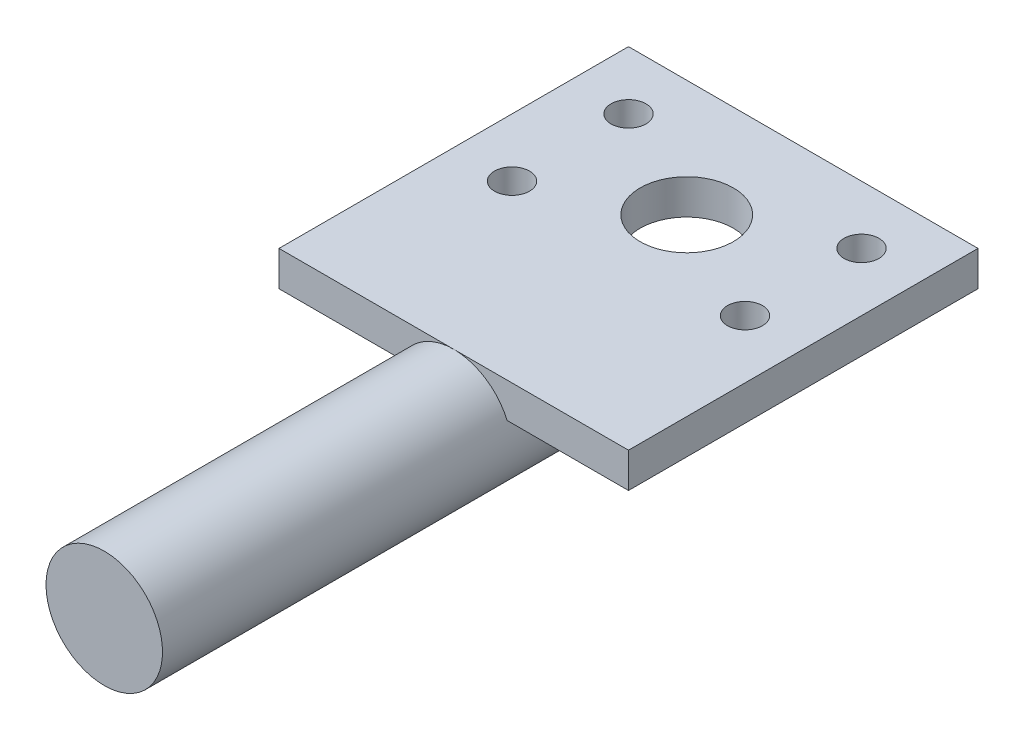
ISO-10303-21;
HEADER;
FILE_DESCRIPTION(('STEP AP214'),'2;1');
FILE_NAME('part.step','',(''),(''),'','','');
FILE_SCHEMA(('AUTOMOTIVE_DESIGN { 1 0 10303 214 1 1 1 1 }'));
ENDSEC;
DATA;
#1=APPLICATION_CONTEXT('core data for automotive mechanical design processes');
#2=APPLICATION_PROTOCOL_DEFINITION('international standard','automotive_design',2000,#1);
#3=PRODUCT_CONTEXT('',#1,'mechanical');
#4=PRODUCT('Part','Part','',(#3));
#5=PRODUCT_RELATED_PRODUCT_CATEGORY('part','',(#4));
#6=PRODUCT_DEFINITION_FORMATION('','',#4);
#7=PRODUCT_DEFINITION_CONTEXT('part definition',#1,'design');
#8=PRODUCT_DEFINITION('design','',#6,#7);
#9=PRODUCT_DEFINITION_SHAPE('','',#8);
#10=(LENGTH_UNIT() NAMED_UNIT(*) SI_UNIT(.MILLI.,.METRE.));
#11=(NAMED_UNIT(*) PLANE_ANGLE_UNIT() SI_UNIT($,.RADIAN.));
#12=(NAMED_UNIT(*) SI_UNIT($,.STERADIAN.) SOLID_ANGLE_UNIT());
#13=UNCERTAINTY_MEASURE_WITH_UNIT(LENGTH_MEASURE(1.E-05),#10,'distance_accuracy_value','');
#14=(GEOMETRIC_REPRESENTATION_CONTEXT(3) GLOBAL_UNCERTAINTY_ASSIGNED_CONTEXT((#13)) GLOBAL_UNIT_ASSIGNED_CONTEXT((#10,
#11,#12)) REPRESENTATION_CONTEXT('',''));
#15=CARTESIAN_POINT('',(0.,0.,0.));
#16=DIRECTION('',(0.,0.,1.));
#17=DIRECTION('',(1.,0.,0.));
#18=AXIS2_PLACEMENT_3D('',#15,#16,#17);
#19=CARTESIAN_POINT('',(-15.,0.,-37.3036296343631));
#20=DIRECTION('',(0.,0.,1.));
#21=DIRECTION('',(1.,0.,0.));
#22=AXIS2_PLACEMENT_3D('',#19,#20,#21);
#23=PLANE('',#22);
#24=DIRECTION('',(0.,1.,0.));
#25=VECTOR('',#24,1.);
#26=CARTESIAN_POINT('',(-15.,0.,-37.3036296343631));
#27=LINE('',#26,#25);
#28=CARTESIAN_POINT('',(-15.,0.,-37.3036296343631));
#29=VERTEX_POINT('',#28);
#30=CARTESIAN_POINT('',(-15.,3.,-37.3036296343631));
#31=VERTEX_POINT('',#30);
#32=EDGE_CURVE('E124',#29,#31,#27,.T.);
#33=ORIENTED_EDGE('',*,*,#32,.T.);
#34=DIRECTION('',(1.,0.,0.));
#35=VECTOR('',#34,1.);
#36=CARTESIAN_POINT('',(0.,3.,-37.3036296343631));
#37=LINE('',#36,#35);
#38=CARTESIAN_POINT('',(15.,3.,-37.3036296343631));
#39=VERTEX_POINT('',#38);
#40=EDGE_CURVE('E123',#31,#39,#37,.T.);
#41=ORIENTED_EDGE('',*,*,#40,.T.);
#42=DIRECTION('',(0.,1.,0.));
#43=VECTOR('',#42,1.);
#44=CARTESIAN_POINT('',(15.,0.,-37.3036296343631));
#45=LINE('',#44,#43);
#46=CARTESIAN_POINT('',(15.,0.,-37.3036296343631));
#47=VERTEX_POINT('',#46);
#48=EDGE_CURVE('E142',#39,#47,#45,.F.);
#49=ORIENTED_EDGE('',*,*,#48,.T.);
#50=DIRECTION('',(1.,0.,0.));
#51=VECTOR('',#50,1.);
#52=CARTESIAN_POINT('',(0.,0.,-37.3036296343631));
#53=LINE('',#52,#51);
#54=EDGE_CURVE('E97',#29,#47,#53,.T.);
#55=ORIENTED_EDGE('',*,*,#54,.F.);
#56=EDGE_LOOP('',(#33,#41,#49,#55));
#57=FACE_BOUND('',#56,.T.);
#58=ADVANCED_FACE('F17',(#57),#23,.F.);
#59=CARTESIAN_POINT('',(10.,0.,-32.3036296343631));
#60=DIRECTION('',(0.,-1.,0.));
#61=DIRECTION('',(0.,0.,-1.));
#62=AXIS2_PLACEMENT_3D('',#59,#60,#61);
#63=CYLINDRICAL_SURFACE('',#62,1.5);
#64=CARTESIAN_POINT('',(10.,0.,-32.3036296343631));
#65=DIRECTION('',(0.,-1.,0.));
#66=DIRECTION('',(0.,0.,-1.));
#67=AXIS2_PLACEMENT_3D('',#64,#65,#66);
#68=CIRCLE('',#67,1.5);
#69=CARTESIAN_POINT('',(10.,0.,-33.8036296343631));
#70=VERTEX_POINT('',#69);
#71=EDGE_CURVE('E119',#70,#70,#68,.F.);
#72=ORIENTED_EDGE('',*,*,#71,.F.);
#73=EDGE_LOOP('',(#72));
#74=FACE_BOUND('',#73,.T.);
#75=CARTESIAN_POINT('',(10.,3.,-32.3036296343631));
#76=DIRECTION('',(0.,-1.,0.));
#77=DIRECTION('',(0.,0.,-1.));
#78=AXIS2_PLACEMENT_3D('',#75,#76,#77);
#79=CIRCLE('',#78,1.5);
#80=CARTESIAN_POINT('',(10.,3.,-33.8036296343631));
#81=VERTEX_POINT('',#80);
#82=EDGE_CURVE('E132',#81,#81,#79,.F.);
#83=ORIENTED_EDGE('',*,*,#82,.T.);
#84=EDGE_LOOP('',(#83));
#85=FACE_BOUND('',#84,.T.);
#86=ADVANCED_FACE('F333',(#74,#85),#63,.F.);
#87=CARTESIAN_POINT('',(10.,0.,-22.3036296343631));
#88=DIRECTION('',(0.,-1.,0.));
#89=DIRECTION('',(0.,0.,-1.));
#90=AXIS2_PLACEMENT_3D('',#87,#88,#89);
#91=CYLINDRICAL_SURFACE('',#90,1.5);
#92=CARTESIAN_POINT('',(10.,0.,-22.3036296343631));
#93=DIRECTION('',(0.,-1.,0.));
#94=DIRECTION('',(0.,0.,-1.));
#95=AXIS2_PLACEMENT_3D('',#92,#93,#94);
#96=CIRCLE('',#95,1.5);
#97=CARTESIAN_POINT('',(10.,0.,-23.8036296343631));
#98=VERTEX_POINT('',#97);
#99=EDGE_CURVE('E169',#98,#98,#96,.F.);
#100=ORIENTED_EDGE('',*,*,#99,.F.);
#101=EDGE_LOOP('',(#100));
#102=FACE_BOUND('',#101,.T.);
#103=CARTESIAN_POINT('',(10.,3.,-22.3036296343631));
#104=DIRECTION('',(0.,-1.,0.));
#105=DIRECTION('',(0.,0.,-1.));
#106=AXIS2_PLACEMENT_3D('',#103,#104,#105);
#107=CIRCLE('',#106,1.5);
#108=CARTESIAN_POINT('',(10.,3.,-23.8036296343631));
#109=VERTEX_POINT('',#108);
#110=EDGE_CURVE('E176',#109,#109,#107,.F.);
#111=ORIENTED_EDGE('',*,*,#110,.T.);
#112=EDGE_LOOP('',(#111));
#113=FACE_BOUND('',#112,.T.);
#114=ADVANCED_FACE('F323',(#102,#113),#91,.F.);
#115=CARTESIAN_POINT('',(-10.,0.,-32.3036296343631));
#116=DIRECTION('',(0.,-1.,0.));
#117=DIRECTION('',(0.,0.,-1.));
#118=AXIS2_PLACEMENT_3D('',#115,#116,#117);
#119=CYLINDRICAL_SURFACE('',#118,1.5);
#120=CARTESIAN_POINT('',(-10.,0.,-32.3036296343631));
#121=DIRECTION('',(0.,-1.,0.));
#122=DIRECTION('',(0.,0.,-1.));
#123=AXIS2_PLACEMENT_3D('',#120,#121,#122);
#124=CIRCLE('',#123,1.5);
#125=CARTESIAN_POINT('',(-10.,0.,-33.8036296343631));
#126=VERTEX_POINT('',#125);
#127=EDGE_CURVE('E166',#126,#126,#124,.F.);
#128=ORIENTED_EDGE('',*,*,#127,.F.);
#129=EDGE_LOOP('',(#128));
#130=FACE_BOUND('',#129,.T.);
#131=CARTESIAN_POINT('',(-10.,3.,-32.3036296343631));
#132=DIRECTION('',(0.,-1.,0.));
#133=DIRECTION('',(0.,0.,-1.));
#134=AXIS2_PLACEMENT_3D('',#131,#132,#133);
#135=CIRCLE('',#134,1.5);
#136=CARTESIAN_POINT('',(-10.,3.,-33.8036296343631));
#137=VERTEX_POINT('',#136);
#138=EDGE_CURVE('E179',#137,#137,#135,.F.);
#139=ORIENTED_EDGE('',*,*,#138,.T.);
#140=EDGE_LOOP('',(#139));
#141=FACE_BOUND('',#140,.T.);
#142=ADVANCED_FACE('F313',(#130,#141),#119,.F.);
#143=CARTESIAN_POINT('',(-10.,0.,-22.3036296343631));
#144=DIRECTION('',(0.,-1.,0.));
#145=DIRECTION('',(0.,0.,-1.));
#146=AXIS2_PLACEMENT_3D('',#143,#144,#145);
#147=CYLINDRICAL_SURFACE('',#146,1.5);
#148=CARTESIAN_POINT('',(-10.,0.,-22.3036296343631));
#149=DIRECTION('',(0.,-1.,0.));
#150=DIRECTION('',(0.,0.,-1.));
#151=AXIS2_PLACEMENT_3D('',#148,#149,#150);
#152=CIRCLE('',#151,1.5);
#153=CARTESIAN_POINT('',(-10.,0.,-23.8036296343631));
#154=VERTEX_POINT('',#153);
#155=EDGE_CURVE('E163',#154,#154,#152,.F.);
#156=ORIENTED_EDGE('',*,*,#155,.F.);
#157=EDGE_LOOP('',(#156));
#158=FACE_BOUND('',#157,.T.);
#159=CARTESIAN_POINT('',(-10.,3.,-22.3036296343631));
#160=DIRECTION('',(0.,-1.,0.));
#161=DIRECTION('',(0.,0.,-1.));
#162=AXIS2_PLACEMENT_3D('',#159,#160,#161);
#163=CIRCLE('',#162,1.5);
#164=CARTESIAN_POINT('',(-10.,3.,-23.8036296343631));
#165=VERTEX_POINT('',#164);
#166=EDGE_CURVE('E181',#165,#165,#163,.F.);
#167=ORIENTED_EDGE('',*,*,#166,.T.);
#168=EDGE_LOOP('',(#167));
#169=FACE_BOUND('',#168,.T.);
#170=ADVANCED_FACE('F303',(#158,#169),#147,.F.);
#171=CARTESIAN_POINT('',(0.,0.,-27.3036296343631));
#172=DIRECTION('',(0.,-1.,0.));
#173=DIRECTION('',(0.,0.,-1.));
#174=AXIS2_PLACEMENT_3D('',#171,#172,#173);
#175=CYLINDRICAL_SURFACE('',#174,4.);
#176=CARTESIAN_POINT('',(0.,0.,-27.3036296343631));
#177=DIRECTION('',(0.,-1.,0.));
#178=DIRECTION('',(0.,0.,-1.));
#179=AXIS2_PLACEMENT_3D('',#176,#177,#178);
#180=CIRCLE('',#179,4.);
#181=CARTESIAN_POINT('',(0.,0.,-31.3036296343631));
#182=VERTEX_POINT('',#181);
#183=EDGE_CURVE('E112',#182,#182,#180,.F.);
#184=ORIENTED_EDGE('',*,*,#183,.F.);
#185=EDGE_LOOP('',(#184));
#186=FACE_BOUND('',#185,.T.);
#187=CARTESIAN_POINT('',(0.,3.,-27.3036296343631));
#188=DIRECTION('',(0.,-1.,0.));
#189=DIRECTION('',(0.,0.,-1.));
#190=AXIS2_PLACEMENT_3D('',#187,#188,#189);
#191=CIRCLE('',#190,4.);
#192=CARTESIAN_POINT('',(0.,3.,-31.3036296343631));
#193=VERTEX_POINT('',#192);
#194=EDGE_CURVE('E20',#193,#193,#191,.F.);
#195=ORIENTED_EDGE('',*,*,#194,.T.);
#196=EDGE_LOOP('',(#195));
#197=FACE_BOUND('',#196,.T.);
#198=ADVANCED_FACE('F188',(#186,#197),#175,.F.);
#199=CARTESIAN_POINT('',(15.,0.,-37.3036296343631));
#200=DIRECTION('',(-1.,0.,0.));
#201=DIRECTION('',(0.,0.,1.));
#202=AXIS2_PLACEMENT_3D('',#199,#200,#201);
#203=PLANE('',#202);
#204=ORIENTED_EDGE('',*,*,#48,.F.);
#205=DIRECTION('',(0.,0.,-1.));
#206=VECTOR('',#205,1.);
#207=CARTESIAN_POINT('',(15.,3.,-22.3036296343631));
#208=LINE('',#207,#206);
#209=CARTESIAN_POINT('',(15.,3.,-7.30362963436312));
#210=VERTEX_POINT('',#209);
#211=EDGE_CURVE('E87',#39,#210,#208,.F.);
#212=ORIENTED_EDGE('',*,*,#211,.T.);
#213=DIRECTION('',(0.,1.,0.));
#214=VECTOR('',#213,1.);
#215=CARTESIAN_POINT('',(15.,0.,-7.30362963436312));
#216=LINE('',#215,#214);
#217=CARTESIAN_POINT('',(15.,0.,-7.30362963436312));
#218=VERTEX_POINT('',#217);
#219=EDGE_CURVE('E80',#210,#218,#216,.F.);
#220=ORIENTED_EDGE('',*,*,#219,.T.);
#221=DIRECTION('',(0.,0.,-1.));
#222=VECTOR('',#221,1.);
#223=CARTESIAN_POINT('',(15.,0.,-22.3036296343631));
#224=LINE('',#223,#222);
#225=EDGE_CURVE('E84',#47,#218,#224,.F.);
#226=ORIENTED_EDGE('',*,*,#225,.F.);
#227=EDGE_LOOP('',(#204,#212,#220,#226));
#228=FACE_BOUND('',#227,.T.);
#229=ADVANCED_FACE('F83',(#228),#203,.F.);
#230=CARTESIAN_POINT('',(-15.,0.,-7.30362963436312));
#231=DIRECTION('',(1.,0.,0.));
#232=DIRECTION('',(0.,0.,-1.));
#233=AXIS2_PLACEMENT_3D('',#230,#231,#232);
#234=PLANE('',#233);
#235=DIRECTION('',(0.,1.,0.));
#236=VECTOR('',#235,1.);
#237=CARTESIAN_POINT('',(-15.,0.,-7.30362963436312));
#238=LINE('',#237,#236);
#239=CARTESIAN_POINT('',(-15.,0.,-7.30362963436312));
#240=VERTEX_POINT('',#239);
#241=CARTESIAN_POINT('',(-15.,3.,-7.30362963436312));
#242=VERTEX_POINT('',#241);
#243=EDGE_CURVE('E104',#240,#242,#238,.T.);
#244=ORIENTED_EDGE('',*,*,#243,.T.);
#245=DIRECTION('',(0.,0.,-1.));
#246=VECTOR('',#245,1.);
#247=CARTESIAN_POINT('',(-15.,3.,-22.3036296343631));
#248=LINE('',#247,#246);
#249=EDGE_CURVE('E120',#242,#31,#248,.T.);
#250=ORIENTED_EDGE('',*,*,#249,.T.);
#251=ORIENTED_EDGE('',*,*,#32,.F.);
#252=DIRECTION('',(0.,0.,-1.));
#253=VECTOR('',#252,1.);
#254=CARTESIAN_POINT('',(-15.,0.,-22.3036296343631));
#255=LINE('',#254,#253);
#256=EDGE_CURVE('E130',#240,#29,#255,.T.);
#257=ORIENTED_EDGE('',*,*,#256,.F.);
#258=EDGE_LOOP('',(#244,#250,#251,#257));
#259=FACE_BOUND('',#258,.T.);
#260=ADVANCED_FACE('F193',(#259),#234,.F.);
#261=CARTESIAN_POINT('',(0.,3.,-22.3036296343631));
#262=DIRECTION('',(0.,-1.,0.));
#263=DIRECTION('',(0.,0.,-1.));
#264=AXIS2_PLACEMENT_3D('',#261,#262,#263);
#265=PLANE('',#264);
#266=ORIENTED_EDGE('',*,*,#82,.F.);
#267=EDGE_LOOP('',(#266));
#268=FACE_BOUND('',#267,.T.);
#269=ORIENTED_EDGE('',*,*,#110,.F.);
#270=EDGE_LOOP('',(#269));
#271=FACE_BOUND('',#270,.T.);
#272=ORIENTED_EDGE('',*,*,#138,.F.);
#273=EDGE_LOOP('',(#272));
#274=FACE_BOUND('',#273,.T.);
#275=ORIENTED_EDGE('',*,*,#166,.F.);
#276=EDGE_LOOP('',(#275));
#277=FACE_BOUND('',#276,.T.);
#278=ORIENTED_EDGE('',*,*,#194,.F.);
#279=EDGE_LOOP('',(#278));
#280=FACE_BOUND('',#279,.T.);
#281=ORIENTED_EDGE('',*,*,#211,.F.);
#282=ORIENTED_EDGE('',*,*,#40,.F.);
#283=ORIENTED_EDGE('',*,*,#249,.F.);
#284=DIRECTION('',(-1.,0.,0.));
#285=VECTOR('',#284,1.);
#286=CARTESIAN_POINT('',(15.,3.,-7.30362963436312));
#287=LINE('',#286,#285);
#288=CARTESIAN_POINT('',(0.,3.,-7.30362963436312));
#289=VERTEX_POINT('',#288);
#290=EDGE_CURVE('E35',#242,#289,#287,.F.);
#291=ORIENTED_EDGE('',*,*,#290,.T.);
#292=DIRECTION('',(-1.,0.,0.));
#293=VECTOR('',#292,1.);
#294=CARTESIAN_POINT('',(15.,3.,-7.30362963436312));
#295=LINE('',#294,#293);
#296=EDGE_CURVE('E91',#289,#210,#295,.F.);
#297=ORIENTED_EDGE('',*,*,#296,.T.);
#298=EDGE_LOOP('',(#281,#282,#283,#291,#297));
#299=FACE_BOUND('',#298,.T.);
#300=ADVANCED_FACE('F190',(#268,#271,#274,#277,#280,#299),#265,.F.);
#301=CARTESIAN_POINT('',(0.,-2.,22.6963703656369));
#302=DIRECTION('',(0.,0.,1.));
#303=DIRECTION('',(1.,0.,0.));
#304=AXIS2_PLACEMENT_3D('',#301,#302,#303);
#305=PLANE('',#304);
#306=CARTESIAN_POINT('',(0.,-2.,22.6963703656369));
#307=DIRECTION('',(0.,0.,-1.));
#308=DIRECTION('',(-1.,0.,0.));
#309=AXIS2_PLACEMENT_3D('',#306,#307,#308);
#310=CIRCLE('',#309,5.);
#311=CARTESIAN_POINT('',(-5.,-2.,22.6963703656369));
#312=VERTEX_POINT('',#311);
#313=EDGE_CURVE('E158',#312,#312,#310,.T.);
#314=ORIENTED_EDGE('',*,*,#313,.F.);
#315=EDGE_LOOP('',(#314));
#316=FACE_BOUND('',#315,.T.);
#317=ADVANCED_FACE('F192',(#316),#305,.T.);
#318=CARTESIAN_POINT('',(0.,-2.,-17.3036296343631));
#319=DIRECTION('',(0.,0.,1.));
#320=DIRECTION('',(1.,0.,0.));
#321=AXIS2_PLACEMENT_3D('',#318,#319,#320);
#322=PLANE('',#321);
#323=CARTESIAN_POINT('',(0.,-2.,-17.3036296343631));
#324=DIRECTION('',(0.,0.,-1.));
#325=DIRECTION('',(-1.,0.,0.));
#326=AXIS2_PLACEMENT_3D('',#323,#324,#325);
#327=CIRCLE('',#326,5.);
#328=CARTESIAN_POINT('',(-4.58257569495584,0.,-17.3036296343631));
#329=VERTEX_POINT('',#328);
#330=CARTESIAN_POINT('',(4.58257569495584,0.,-17.3036296343631));
#331=VERTEX_POINT('',#330);
#332=EDGE_CURVE('E117',#329,#331,#327,.F.);
#333=ORIENTED_EDGE('',*,*,#332,.F.);
#334=DIRECTION('',(1.,0.,0.));
#335=VECTOR('',#334,1.);
#336=CARTESIAN_POINT('',(0.,0.,-17.3036296343631));
#337=LINE('',#336,#335);
#338=EDGE_CURVE('E47',#331,#329,#337,.F.);
#339=ORIENTED_EDGE('',*,*,#338,.F.);
#340=EDGE_LOOP('',(#333,#339));
#341=FACE_BOUND('',#340,.T.);
#342=ADVANCED_FACE('F205',(#341),#322,.F.);
#343=CARTESIAN_POINT('',(0.,0.,-22.3036296343631));
#344=DIRECTION('',(0.,-1.,0.));
#345=DIRECTION('',(0.,0.,-1.));
#346=AXIS2_PLACEMENT_3D('',#343,#344,#345);
#347=PLANE('',#346);
#348=ORIENTED_EDGE('',*,*,#183,.T.);
#349=EDGE_LOOP('',(#348));
#350=FACE_BOUND('',#349,.T.);
#351=ORIENTED_EDGE('',*,*,#155,.T.);
#352=EDGE_LOOP('',(#351));
#353=FACE_BOUND('',#352,.T.);
#354=ORIENTED_EDGE('',*,*,#127,.T.);
#355=EDGE_LOOP('',(#354));
#356=FACE_BOUND('',#355,.T.);
#357=ORIENTED_EDGE('',*,*,#99,.T.);
#358=EDGE_LOOP('',(#357));
#359=FACE_BOUND('',#358,.T.);
#360=ORIENTED_EDGE('',*,*,#71,.T.);
#361=EDGE_LOOP('',(#360));
#362=FACE_BOUND('',#361,.T.);
#363=DIRECTION('',(0.,0.,-1.));
#364=VECTOR('',#363,1.);
#365=CARTESIAN_POINT('',(4.58257569495584,0.,-7.30362963436312));
#366=LINE('',#365,#364);
#367=CARTESIAN_POINT('',(4.58257569495584,0.,-7.30362963436312));
#368=VERTEX_POINT('',#367);
#369=EDGE_CURVE('E115',#331,#368,#366,.F.);
#370=ORIENTED_EDGE('',*,*,#369,.F.);
#371=ORIENTED_EDGE('',*,*,#338,.T.);
#372=DIRECTION('',(0.,0.,-1.));
#373=VECTOR('',#372,1.);
#374=CARTESIAN_POINT('',(-4.58257569495584,0.,-7.30362963436312));
#375=LINE('',#374,#373);
#376=CARTESIAN_POINT('',(-4.58257569495584,0.,-7.30362963436312));
#377=VERTEX_POINT('',#376);
#378=EDGE_CURVE('E52',#377,#329,#375,.T.);
#379=ORIENTED_EDGE('',*,*,#378,.F.);
#380=DIRECTION('',(-1.,0.,0.));
#381=VECTOR('',#380,1.);
#382=CARTESIAN_POINT('',(15.,0.,-7.30362963436312));
#383=LINE('',#382,#381);
#384=EDGE_CURVE('E102',#377,#240,#383,.T.);
#385=ORIENTED_EDGE('',*,*,#384,.T.);
#386=ORIENTED_EDGE('',*,*,#256,.T.);
#387=ORIENTED_EDGE('',*,*,#54,.T.);
#388=ORIENTED_EDGE('',*,*,#225,.T.);
#389=DIRECTION('',(-1.,0.,0.));
#390=VECTOR('',#389,1.);
#391=CARTESIAN_POINT('',(15.,0.,-7.30362963436312));
#392=LINE('',#391,#390);
#393=EDGE_CURVE('E90',#218,#368,#392,.T.);
#394=ORIENTED_EDGE('',*,*,#393,.T.);
#395=EDGE_LOOP('',(#370,#371,#379,#385,#386,#387,#388,#394));
#396=FACE_BOUND('',#395,.T.);
#397=ADVANCED_FACE('F93',(#350,#353,#356,#359,#362,#396),#347,.T.);
#398=CARTESIAN_POINT('',(15.,0.,-7.30362963436312));
#399=DIRECTION('',(0.,0.,-1.));
#400=DIRECTION('',(-1.,0.,0.));
#401=AXIS2_PLACEMENT_3D('',#398,#399,#400);
#402=PLANE('',#401);
#403=ORIENTED_EDGE('',*,*,#393,.F.);
#404=ORIENTED_EDGE('',*,*,#219,.F.);
#405=ORIENTED_EDGE('',*,*,#296,.F.);
#406=CARTESIAN_POINT('',(0.,-2.,-7.30362963436312));
#407=DIRECTION('',(0.,0.,-1.));
#408=DIRECTION('',(-1.,0.,0.));
#409=AXIS2_PLACEMENT_3D('',#406,#407,#408);
#410=CIRCLE('',#409,5.);
#411=EDGE_CURVE('E26',#368,#289,#410,.F.);
#412=ORIENTED_EDGE('',*,*,#411,.F.);
#413=EDGE_LOOP('',(#403,#404,#405,#412));
#414=FACE_BOUND('',#413,.T.);
#415=ADVANCED_FACE('F99',(#414),#402,.F.);
#416=CARTESIAN_POINT('',(15.,0.,-7.30362963436312));
#417=DIRECTION('',(0.,0.,-1.));
#418=DIRECTION('',(-1.,0.,0.));
#419=AXIS2_PLACEMENT_3D('',#416,#417,#418);
#420=PLANE('',#419);
#421=ORIENTED_EDGE('',*,*,#290,.F.);
#422=ORIENTED_EDGE('',*,*,#243,.F.);
#423=ORIENTED_EDGE('',*,*,#384,.F.);
#424=CARTESIAN_POINT('',(0.,-2.,-7.30362963436312));
#425=DIRECTION('',(0.,0.,-1.));
#426=DIRECTION('',(-1.,0.,0.));
#427=AXIS2_PLACEMENT_3D('',#424,#425,#426);
#428=CIRCLE('',#427,5.);
#429=EDGE_CURVE('E11',#289,#377,#428,.F.);
#430=ORIENTED_EDGE('',*,*,#429,.F.);
#431=EDGE_LOOP('',(#421,#422,#423,#430));
#432=FACE_BOUND('',#431,.T.);
#433=ADVANCED_FACE('F199',(#432),#420,.F.);
#434=CARTESIAN_POINT('',(0.,-2.,-7.30362963436312));
#435=DIRECTION('',(0.,0.,-1.));
#436=DIRECTION('',(-1.,0.,0.));
#437=AXIS2_PLACEMENT_3D('',#434,#435,#436);
#438=CYLINDRICAL_SURFACE('',#437,5.);
#439=ORIENTED_EDGE('',*,*,#411,.T.);
#440=ORIENTED_EDGE('',*,*,#429,.T.);
#441=ORIENTED_EDGE('',*,*,#378,.T.);
#442=ORIENTED_EDGE('',*,*,#332,.T.);
#443=ORIENTED_EDGE('',*,*,#369,.T.);
#444=EDGE_LOOP('',(#439,#440,#441,#442,#443));
#445=FACE_BOUND('',#444,.T.);
#446=ORIENTED_EDGE('',*,*,#313,.T.);
#447=EDGE_LOOP('',(#446));
#448=FACE_BOUND('',#447,.T.);
#449=ADVANCED_FACE('F202',(#445,#448),#438,.T.);
#450=CLOSED_SHELL('',(#58,#86,#114,#142,#170,#198,#229,#260,#300,#317,#342,#397,#415,#433,#449));
#451=MANIFOLD_SOLID_BREP('B1',#450);
#452=ADVANCED_BREP_SHAPE_REPRESENTATION('',(#18,#451),#14);
#453=SHAPE_DEFINITION_REPRESENTATION(#9,#452);
ENDSEC;
END-ISO-10303-21;
